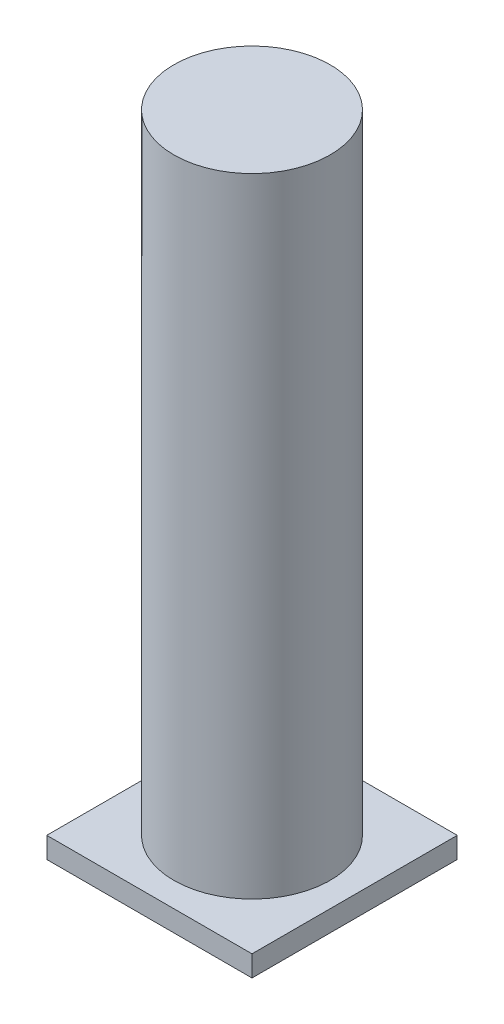
ISO-10303-21;
HEADER;
FILE_DESCRIPTION(('STEP AP214'),'2;1');
FILE_NAME('part.step','',(''),(''),'','','');
FILE_SCHEMA(('AUTOMOTIVE_DESIGN { 1 0 10303 214 1 1 1 1 }'));
ENDSEC;
DATA;
#1=APPLICATION_CONTEXT('core data for automotive mechanical design processes');
#2=APPLICATION_PROTOCOL_DEFINITION('international standard','automotive_design',2000,#1);
#3=PRODUCT_CONTEXT('',#1,'mechanical');
#4=PRODUCT('Part','Part','',(#3));
#5=PRODUCT_RELATED_PRODUCT_CATEGORY('part','',(#4));
#6=PRODUCT_DEFINITION_FORMATION('','',#4);
#7=PRODUCT_DEFINITION_CONTEXT('part definition',#1,'design');
#8=PRODUCT_DEFINITION('design','',#6,#7);
#9=PRODUCT_DEFINITION_SHAPE('','',#8);
#10=(LENGTH_UNIT() NAMED_UNIT(*) SI_UNIT(.MILLI.,.METRE.));
#11=(NAMED_UNIT(*) PLANE_ANGLE_UNIT() SI_UNIT($,.RADIAN.));
#12=(NAMED_UNIT(*) SI_UNIT($,.STERADIAN.) SOLID_ANGLE_UNIT());
#13=UNCERTAINTY_MEASURE_WITH_UNIT(LENGTH_MEASURE(1.E-05),#10,'distance_accuracy_value','');
#14=(GEOMETRIC_REPRESENTATION_CONTEXT(3) GLOBAL_UNCERTAINTY_ASSIGNED_CONTEXT((#13)) GLOBAL_UNIT_ASSIGNED_CONTEXT((#10,
#11,#12)) REPRESENTATION_CONTEXT('',''));
#15=CARTESIAN_POINT('',(0.,0.,0.));
#16=DIRECTION('',(0.,0.,1.));
#17=DIRECTION('',(1.,0.,0.));
#18=AXIS2_PLACEMENT_3D('',#15,#16,#17);
#19=CARTESIAN_POINT('',(2.45,0.5,-2.45));
#20=DIRECTION('',(-1.,0.,0.));
#21=DIRECTION('',(0.,0.,1.));
#22=AXIS2_PLACEMENT_3D('',#19,#20,#21);
#23=PLANE('',#22);
#24=DIRECTION('',(0.,0.,-1.));
#25=VECTOR('',#24,1.);
#26=CARTESIAN_POINT('',(2.45,0.,-2.45));
#27=LINE('',#26,#25);
#28=CARTESIAN_POINT('',(2.45,0.,2.45));
#29=VERTEX_POINT('',#28);
#30=CARTESIAN_POINT('',(2.45,0.,-2.45));
#31=VERTEX_POINT('',#30);
#32=EDGE_CURVE('E103',#29,#31,#27,.T.);
#33=ORIENTED_EDGE('',*,*,#32,.T.);
#34=DIRECTION('',(0.,-1.,0.));
#35=VECTOR('',#34,1.);
#36=CARTESIAN_POINT('',(2.45,0.5,-2.45));
#37=LINE('',#36,#35);
#38=CARTESIAN_POINT('',(2.45,0.5,-2.45));
#39=VERTEX_POINT('',#38);
#40=EDGE_CURVE('E40',#39,#31,#37,.T.);
#41=ORIENTED_EDGE('',*,*,#40,.F.);
#42=DIRECTION('',(0.,0.,-1.));
#43=VECTOR('',#42,1.);
#44=CARTESIAN_POINT('',(2.45,0.5,-2.45));
#45=LINE('',#44,#43);
#46=CARTESIAN_POINT('',(2.45,0.5,2.45));
#47=VERTEX_POINT('',#46);
#48=EDGE_CURVE('E90',#47,#39,#45,.T.);
#49=ORIENTED_EDGE('',*,*,#48,.F.);
#50=DIRECTION('',(0.,-1.,0.));
#51=VECTOR('',#50,1.);
#52=CARTESIAN_POINT('',(2.45,0.5,2.45));
#53=LINE('',#52,#51);
#54=EDGE_CURVE('E99',#47,#29,#53,.T.);
#55=ORIENTED_EDGE('',*,*,#54,.T.);
#56=EDGE_LOOP('',(#33,#41,#49,#55));
#57=FACE_BOUND('',#56,.T.);
#58=ADVANCED_FACE('F37',(#57),#23,.F.);
#59=CARTESIAN_POINT('',(-2.45,0.5,-2.45));
#60=DIRECTION('',(0.,0.,1.));
#61=DIRECTION('',(1.,0.,0.));
#62=AXIS2_PLACEMENT_3D('',#59,#60,#61);
#63=PLANE('',#62);
#64=DIRECTION('',(-1.,0.,0.));
#65=VECTOR('',#64,1.);
#66=CARTESIAN_POINT('',(-2.45,0.,-2.45));
#67=LINE('',#66,#65);
#68=CARTESIAN_POINT('',(-2.45,0.,-2.45));
#69=VERTEX_POINT('',#68);
#70=EDGE_CURVE('E95',#31,#69,#67,.T.);
#71=ORIENTED_EDGE('',*,*,#70,.T.);
#72=DIRECTION('',(0.,-1.,0.));
#73=VECTOR('',#72,1.);
#74=CARTESIAN_POINT('',(-2.45,0.5,-2.45));
#75=LINE('',#74,#73);
#76=CARTESIAN_POINT('',(-2.45,0.5,-2.45));
#77=VERTEX_POINT('',#76);
#78=EDGE_CURVE('E93',#77,#69,#75,.T.);
#79=ORIENTED_EDGE('',*,*,#78,.F.);
#80=DIRECTION('',(-1.,0.,0.));
#81=VECTOR('',#80,1.);
#82=CARTESIAN_POINT('',(-2.45,0.5,-2.45));
#83=LINE('',#82,#81);
#84=EDGE_CURVE('E85',#39,#77,#83,.T.);
#85=ORIENTED_EDGE('',*,*,#84,.F.);
#86=ORIENTED_EDGE('',*,*,#40,.T.);
#87=EDGE_LOOP('',(#71,#79,#85,#86));
#88=FACE_BOUND('',#87,.T.);
#89=ADVANCED_FACE('F94',(#88),#63,.F.);
#90=CARTESIAN_POINT('',(-2.45,0.5,-2.45));
#91=DIRECTION('',(1.,0.,0.));
#92=DIRECTION('',(0.,0.,-1.));
#93=AXIS2_PLACEMENT_3D('',#90,#91,#92);
#94=PLANE('',#93);
#95=DIRECTION('',(0.,0.,1.));
#96=VECTOR('',#95,1.);
#97=CARTESIAN_POINT('',(-2.45,0.,-2.45));
#98=LINE('',#97,#96);
#99=CARTESIAN_POINT('',(-2.45,0.,2.45));
#100=VERTEX_POINT('',#99);
#101=EDGE_CURVE('E71',#69,#100,#98,.T.);
#102=ORIENTED_EDGE('',*,*,#101,.T.);
#103=DIRECTION('',(0.,-1.,0.));
#104=VECTOR('',#103,1.);
#105=CARTESIAN_POINT('',(-2.45,0.5,2.45));
#106=LINE('',#105,#104);
#107=CARTESIAN_POINT('',(-2.45,0.5,2.45));
#108=VERTEX_POINT('',#107);
#109=EDGE_CURVE('E96',#108,#100,#106,.T.);
#110=ORIENTED_EDGE('',*,*,#109,.F.);
#111=DIRECTION('',(0.,0.,1.));
#112=VECTOR('',#111,1.);
#113=CARTESIAN_POINT('',(-2.45,0.5,-2.45));
#114=LINE('',#113,#112);
#115=EDGE_CURVE('E88',#77,#108,#114,.T.);
#116=ORIENTED_EDGE('',*,*,#115,.F.);
#117=ORIENTED_EDGE('',*,*,#78,.T.);
#118=EDGE_LOOP('',(#102,#110,#116,#117));
#119=FACE_BOUND('',#118,.T.);
#120=ADVANCED_FACE('F97',(#119),#94,.F.);
#121=CARTESIAN_POINT('',(-2.45,0.5,2.45));
#122=DIRECTION('',(0.,0.,-1.));
#123=DIRECTION('',(-1.,0.,0.));
#124=AXIS2_PLACEMENT_3D('',#121,#122,#123);
#125=PLANE('',#124);
#126=DIRECTION('',(1.,0.,0.));
#127=VECTOR('',#126,1.);
#128=CARTESIAN_POINT('',(-2.45,0.,2.45));
#129=LINE('',#128,#127);
#130=EDGE_CURVE('E77',#100,#29,#129,.T.);
#131=ORIENTED_EDGE('',*,*,#130,.T.);
#132=ORIENTED_EDGE('',*,*,#54,.F.);
#133=DIRECTION('',(1.,0.,0.));
#134=VECTOR('',#133,1.);
#135=CARTESIAN_POINT('',(-2.45,0.5,2.45));
#136=LINE('',#135,#134);
#137=EDGE_CURVE('E54',#108,#47,#136,.T.);
#138=ORIENTED_EDGE('',*,*,#137,.F.);
#139=ORIENTED_EDGE('',*,*,#109,.T.);
#140=EDGE_LOOP('',(#131,#132,#138,#139));
#141=FACE_BOUND('',#140,.T.);
#142=ADVANCED_FACE('F111',(#141),#125,.F.);
#143=CARTESIAN_POINT('',(0.,0.5,0.));
#144=DIRECTION('',(0.,1.,0.));
#145=DIRECTION('',(0.,0.,1.));
#146=AXIS2_PLACEMENT_3D('',#143,#144,#145);
#147=PLANE('',#146);
#148=CARTESIAN_POINT('',(0.,0.5,0.));
#149=DIRECTION('',(0.,1.,0.));
#150=DIRECTION('',(0.,0.,1.));
#151=AXIS2_PLACEMENT_3D('',#148,#149,#150);
#152=CIRCLE('',#151,1.86560576714583);
#153=CARTESIAN_POINT('',(0.,0.5,1.86560576714583));
#154=VERTEX_POINT('',#153);
#155=EDGE_CURVE('E11',#154,#154,#152,.T.);
#156=ORIENTED_EDGE('',*,*,#155,.F.);
#157=EDGE_LOOP('',(#156));
#158=FACE_BOUND('',#157,.T.);
#159=ORIENTED_EDGE('',*,*,#48,.T.);
#160=ORIENTED_EDGE('',*,*,#84,.T.);
#161=ORIENTED_EDGE('',*,*,#115,.T.);
#162=ORIENTED_EDGE('',*,*,#137,.T.);
#163=EDGE_LOOP('',(#159,#160,#161,#162));
#164=FACE_BOUND('',#163,.T.);
#165=ADVANCED_FACE('F86',(#158,#164),#147,.T.);
#166=CARTESIAN_POINT('',(0.,0.,0.));
#167=DIRECTION('',(0.,1.,0.));
#168=DIRECTION('',(0.,0.,1.));
#169=AXIS2_PLACEMENT_3D('',#166,#167,#168);
#170=PLANE('',#169);
#171=ORIENTED_EDGE('',*,*,#32,.F.);
#172=ORIENTED_EDGE('',*,*,#130,.F.);
#173=ORIENTED_EDGE('',*,*,#101,.F.);
#174=ORIENTED_EDGE('',*,*,#70,.F.);
#175=EDGE_LOOP('',(#171,#172,#173,#174));
#176=FACE_BOUND('',#175,.T.);
#177=ADVANCED_FACE('F114',(#176),#170,.F.);
#178=CARTESIAN_POINT('',(0.,15.5,0.));
#179=DIRECTION('',(0.,-1.,0.));
#180=DIRECTION('',(0.,0.,-1.));
#181=AXIS2_PLACEMENT_3D('',#178,#179,#180);
#182=CYLINDRICAL_SURFACE('',#181,1.86560576714583);
#183=CARTESIAN_POINT('',(0.,15.5,0.));
#184=DIRECTION('',(0.,1.,0.));
#185=DIRECTION('',(0.,0.,1.));
#186=AXIS2_PLACEMENT_3D('',#183,#184,#185);
#187=CIRCLE('',#186,1.86560576714583);
#188=CARTESIAN_POINT('',(0.,15.5,1.86560576714583));
#189=VERTEX_POINT('',#188);
#190=EDGE_CURVE('E106',#189,#189,#187,.T.);
#191=ORIENTED_EDGE('',*,*,#190,.F.);
#192=EDGE_LOOP('',(#191));
#193=FACE_BOUND('',#192,.T.);
#194=ORIENTED_EDGE('',*,*,#155,.T.);
#195=EDGE_LOOP('',(#194));
#196=FACE_BOUND('',#195,.T.);
#197=ADVANCED_FACE('F122',(#193,#196),#182,.T.);
#198=CARTESIAN_POINT('',(0.,15.5,0.));
#199=DIRECTION('',(0.,1.,0.));
#200=DIRECTION('',(0.,0.,1.));
#201=AXIS2_PLACEMENT_3D('',#198,#199,#200);
#202=PLANE('',#201);
#203=ORIENTED_EDGE('',*,*,#190,.T.);
#204=EDGE_LOOP('',(#203));
#205=FACE_BOUND('',#204,.T.);
#206=ADVANCED_FACE('F120',(#205),#202,.T.);
#207=CLOSED_SHELL('',(#58,#89,#120,#142,#165,#177,#197,#206));
#208=MANIFOLD_SOLID_BREP('B2',#207);
#209=ADVANCED_BREP_SHAPE_REPRESENTATION('',(#18,#208),#14);
#210=SHAPE_DEFINITION_REPRESENTATION(#9,#209);
ENDSEC;
END-ISO-10303-21;
